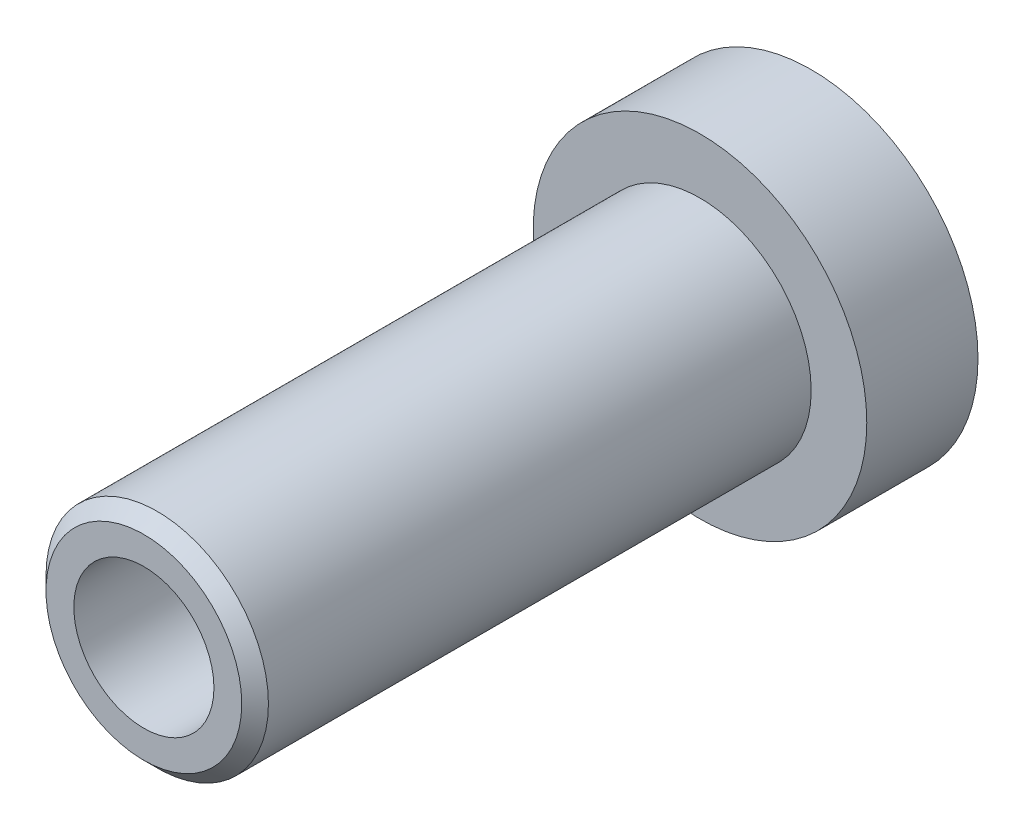
ISO-10303-21;
HEADER;
FILE_DESCRIPTION(('STEP AP214'),'2;1');
FILE_NAME('part.step','',(''),(''),'','','');
FILE_SCHEMA(('AUTOMOTIVE_DESIGN { 1 0 10303 214 1 1 1 1 }'));
ENDSEC;
DATA;
#1=APPLICATION_CONTEXT('core data for automotive mechanical design processes');
#2=APPLICATION_PROTOCOL_DEFINITION('international standard','automotive_design',2000,#1);
#3=PRODUCT_CONTEXT('',#1,'mechanical');
#4=PRODUCT('Part','Part','',(#3));
#5=PRODUCT_RELATED_PRODUCT_CATEGORY('part','',(#4));
#6=PRODUCT_DEFINITION_FORMATION('','',#4);
#7=PRODUCT_DEFINITION_CONTEXT('part definition',#1,'design');
#8=PRODUCT_DEFINITION('design','',#6,#7);
#9=PRODUCT_DEFINITION_SHAPE('','',#8);
#10=(LENGTH_UNIT() NAMED_UNIT(*) SI_UNIT(.MILLI.,.METRE.));
#11=(NAMED_UNIT(*) PLANE_ANGLE_UNIT() SI_UNIT($,.RADIAN.));
#12=(NAMED_UNIT(*) SI_UNIT($,.STERADIAN.) SOLID_ANGLE_UNIT());
#13=UNCERTAINTY_MEASURE_WITH_UNIT(LENGTH_MEASURE(1.E-05),#10,'distance_accuracy_value','');
#14=(GEOMETRIC_REPRESENTATION_CONTEXT(3) GLOBAL_UNCERTAINTY_ASSIGNED_CONTEXT((#13)) GLOBAL_UNIT_ASSIGNED_CONTEXT((#10,
#11,#12)) REPRESENTATION_CONTEXT('',''));
#15=CARTESIAN_POINT('',(0.,0.,0.));
#16=DIRECTION('',(0.,0.,1.));
#17=DIRECTION('',(1.,0.,0.));
#18=AXIS2_PLACEMENT_3D('',#15,#16,#17);
#19=CARTESIAN_POINT('',(0.,0.,3.));
#20=DIRECTION('',(0.,0.,-1.));
#21=DIRECTION('',(-1.,0.,0.));
#22=AXIS2_PLACEMENT_3D('',#19,#20,#21);
#23=CYLINDRICAL_SURFACE('',#22,0.5);
#24=CARTESIAN_POINT('',(0.,0.,0.5));
#25=DIRECTION('',(0.,0.,1.));
#26=DIRECTION('',(1.,0.,0.));
#27=AXIS2_PLACEMENT_3D('',#24,#25,#26);
#28=CIRCLE('',#27,0.5);
#29=CARTESIAN_POINT('',(0.5,0.,0.5));
#30=VERTEX_POINT('',#29);
#31=EDGE_CURVE('E11',#30,#30,#28,.T.);
#32=ORIENTED_EDGE('',*,*,#31,.T.);
#33=EDGE_LOOP('',(#32));
#34=FACE_BOUND('',#33,.T.);
#35=CARTESIAN_POINT('',(0.,0.,2.94));
#36=DIRECTION('',(0.,0.,1.));
#37=DIRECTION('',(1.,0.,0.));
#38=AXIS2_PLACEMENT_3D('',#35,#36,#37);
#39=CIRCLE('',#38,0.5);
#40=CARTESIAN_POINT('',(0.5,0.,2.94));
#41=VERTEX_POINT('',#40);
#42=EDGE_CURVE('E54',#41,#41,#39,.T.);
#43=ORIENTED_EDGE('',*,*,#42,.F.);
#44=EDGE_LOOP('',(#43));
#45=FACE_BOUND('',#44,.T.);
#46=ADVANCED_FACE('F36',(#34,#45),#23,.T.);
#47=CARTESIAN_POINT('',(0.,0.,3.));
#48=DIRECTION('',(0.,0.,1.));
#49=DIRECTION('',(1.,0.,0.));
#50=AXIS2_PLACEMENT_3D('',#47,#48,#49);
#51=PLANE('',#50);
#52=CARTESIAN_POINT('',(0.,0.,3.));
#53=DIRECTION('',(0.,0.,1.));
#54=DIRECTION('',(1.,0.,0.));
#55=AXIS2_PLACEMENT_3D('',#52,#53,#54);
#56=CIRCLE('',#55,0.315);
#57=CARTESIAN_POINT('',(0.315,0.,3.));
#58=VERTEX_POINT('',#57);
#59=EDGE_CURVE('E50',#58,#58,#56,.T.);
#60=ORIENTED_EDGE('',*,*,#59,.F.);
#61=EDGE_LOOP('',(#60));
#62=FACE_BOUND('',#61,.T.);
#63=CARTESIAN_POINT('',(0.,0.,3.));
#64=DIRECTION('',(0.,0.,1.));
#65=DIRECTION('',(1.,0.,0.));
#66=AXIS2_PLACEMENT_3D('',#63,#64,#65);
#67=CIRCLE('',#66,0.44);
#68=CARTESIAN_POINT('',(0.44,0.,3.));
#69=VERTEX_POINT('',#68);
#70=EDGE_CURVE('E59',#69,#69,#67,.T.);
#71=ORIENTED_EDGE('',*,*,#70,.T.);
#72=EDGE_LOOP('',(#71));
#73=FACE_BOUND('',#72,.T.);
#74=ADVANCED_FACE('F63',(#62,#73),#51,.T.);
#75=CARTESIAN_POINT('',(0.,0.,0.5));
#76=DIRECTION('',(0.,0.,-1.));
#77=DIRECTION('',(-1.,0.,0.));
#78=AXIS2_PLACEMENT_3D('',#75,#76,#77);
#79=CYLINDRICAL_SURFACE('',#78,0.75);
#80=CARTESIAN_POINT('',(0.,0.,0.5));
#81=DIRECTION('',(0.,0.,1.));
#82=DIRECTION('',(1.,0.,0.));
#83=AXIS2_PLACEMENT_3D('',#80,#81,#82);
#84=CIRCLE('',#83,0.75);
#85=CARTESIAN_POINT('',(0.75,0.,0.5));
#86=VERTEX_POINT('',#85);
#87=EDGE_CURVE('E44',#86,#86,#84,.T.);
#88=ORIENTED_EDGE('',*,*,#87,.F.);
#89=EDGE_LOOP('',(#88));
#90=FACE_BOUND('',#89,.T.);
#91=CARTESIAN_POINT('',(0.,0.,0.));
#92=DIRECTION('',(0.,0.,1.));
#93=DIRECTION('',(1.,0.,0.));
#94=AXIS2_PLACEMENT_3D('',#91,#92,#93);
#95=CIRCLE('',#94,0.75);
#96=CARTESIAN_POINT('',(0.75,0.,0.));
#97=VERTEX_POINT('',#96);
#98=EDGE_CURVE('E40',#97,#97,#95,.T.);
#99=ORIENTED_EDGE('',*,*,#98,.T.);
#100=EDGE_LOOP('',(#99));
#101=FACE_BOUND('',#100,.T.);
#102=ADVANCED_FACE('F38',(#90,#101),#79,.T.);
#103=CARTESIAN_POINT('',(0.,0.,0.5));
#104=DIRECTION('',(0.,0.,1.));
#105=DIRECTION('',(1.,0.,0.));
#106=AXIS2_PLACEMENT_3D('',#103,#104,#105);
#107=PLANE('',#106);
#108=ORIENTED_EDGE('',*,*,#31,.F.);
#109=EDGE_LOOP('',(#108));
#110=FACE_BOUND('',#109,.T.);
#111=ORIENTED_EDGE('',*,*,#87,.T.);
#112=EDGE_LOOP('',(#111));
#113=FACE_BOUND('',#112,.T.);
#114=ADVANCED_FACE('F85',(#110,#113),#107,.T.);
#115=CARTESIAN_POINT('',(0.,0.,0.));
#116=DIRECTION('',(0.,0.,1.));
#117=DIRECTION('',(1.,0.,0.));
#118=AXIS2_PLACEMENT_3D('',#115,#116,#117);
#119=PLANE('',#118);
#120=CARTESIAN_POINT('',(0.,0.,0.));
#121=DIRECTION('',(0.,0.,1.));
#122=DIRECTION('',(1.,0.,0.));
#123=AXIS2_PLACEMENT_3D('',#120,#121,#122);
#124=CIRCLE('',#123,0.315);
#125=CARTESIAN_POINT('',(0.315,0.,0.));
#126=VERTEX_POINT('',#125);
#127=EDGE_CURVE('E53',#126,#126,#124,.T.);
#128=ORIENTED_EDGE('',*,*,#127,.T.);
#129=EDGE_LOOP('',(#128));
#130=FACE_BOUND('',#129,.T.);
#131=ORIENTED_EDGE('',*,*,#98,.F.);
#132=EDGE_LOOP('',(#131));
#133=FACE_BOUND('',#132,.T.);
#134=ADVANCED_FACE('F73',(#130,#133),#119,.F.);
#135=CARTESIAN_POINT('',(0.,0.,0.));
#136=DIRECTION('',(0.,0.,1.));
#137=DIRECTION('',(1.,0.,0.));
#138=AXIS2_PLACEMENT_3D('',#135,#136,#137);
#139=CYLINDRICAL_SURFACE('',#138,0.315);
#140=ORIENTED_EDGE('',*,*,#127,.F.);
#141=EDGE_LOOP('',(#140));
#142=FACE_BOUND('',#141,.T.);
#143=ORIENTED_EDGE('',*,*,#59,.T.);
#144=EDGE_LOOP('',(#143));
#145=FACE_BOUND('',#144,.T.);
#146=ADVANCED_FACE('F67',(#142,#145),#139,.F.);
#147=CARTESIAN_POINT('',(0.,0.,3.));
#148=DIRECTION('',(0.,0.,-1.));
#149=DIRECTION('',(-1.,0.,0.));
#150=AXIS2_PLACEMENT_3D('',#147,#148,#149);
#151=CONICAL_SURFACE('',#150,0.44,0.785398163397447);
#152=ORIENTED_EDGE('',*,*,#42,.T.);
#153=EDGE_LOOP('',(#152));
#154=FACE_BOUND('',#153,.T.);
#155=ORIENTED_EDGE('',*,*,#70,.F.);
#156=EDGE_LOOP('',(#155));
#157=FACE_BOUND('',#156,.T.);
#158=ADVANCED_FACE('F65',(#154,#157),#151,.T.);
#159=CLOSED_SHELL('',(#46,#74,#102,#114,#134,#146,#158));
#160=MANIFOLD_SOLID_BREP('B2',#159);
#161=ADVANCED_BREP_SHAPE_REPRESENTATION('',(#18,#160),#14);
#162=SHAPE_DEFINITION_REPRESENTATION(#9,#161);
ENDSEC;
END-ISO-10303-21;
